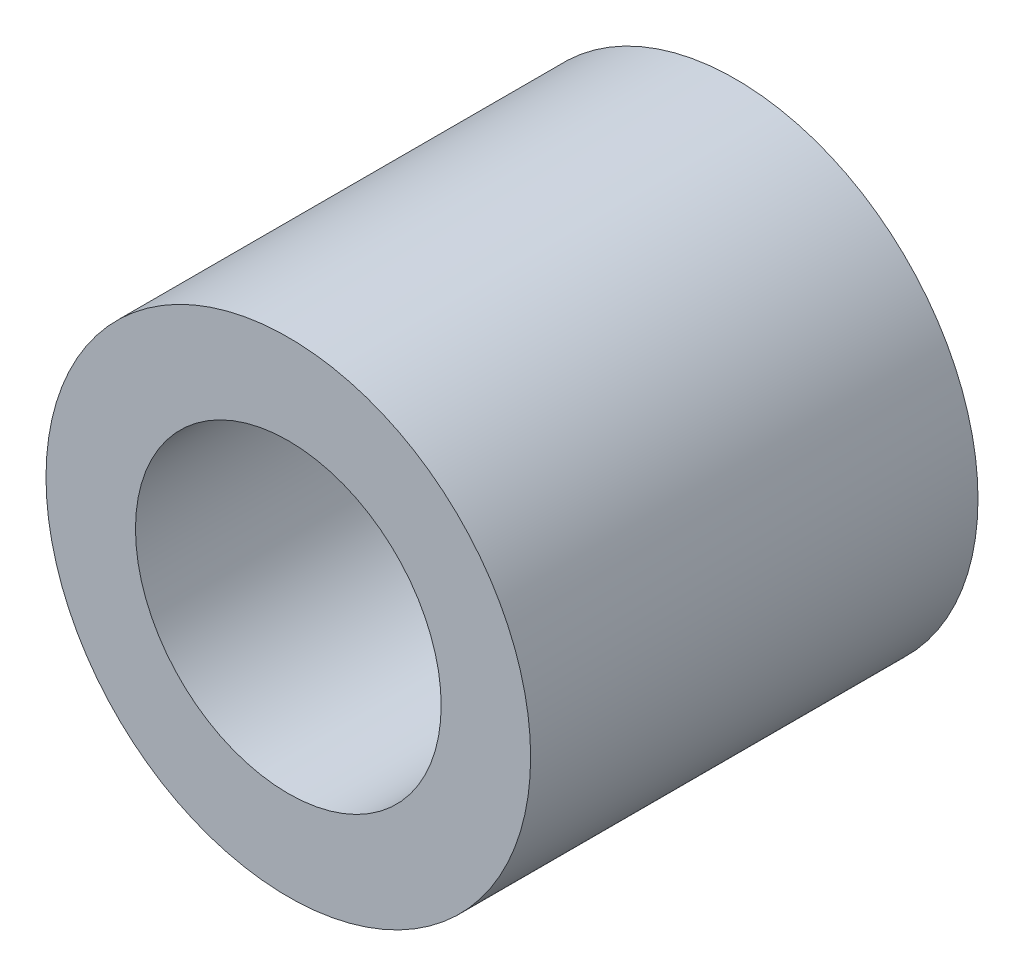
ISO-10303-21;
HEADER;
FILE_DESCRIPTION(('STEP AP214'),'2;1');
FILE_NAME('part.step','',(''),(''),'','','');
FILE_SCHEMA(('AUTOMOTIVE_DESIGN { 1 0 10303 214 1 1 1 1 }'));
ENDSEC;
DATA;
#1=APPLICATION_CONTEXT('core data for automotive mechanical design processes');
#2=APPLICATION_PROTOCOL_DEFINITION('international standard','automotive_design',2000,#1);
#3=PRODUCT_CONTEXT('',#1,'mechanical');
#4=PRODUCT('Part','Part','',(#3));
#5=PRODUCT_RELATED_PRODUCT_CATEGORY('part','',(#4));
#6=PRODUCT_DEFINITION_FORMATION('','',#4);
#7=PRODUCT_DEFINITION_CONTEXT('part definition',#1,'design');
#8=PRODUCT_DEFINITION('design','',#6,#7);
#9=PRODUCT_DEFINITION_SHAPE('','',#8);
#10=(LENGTH_UNIT() NAMED_UNIT(*) SI_UNIT(.MILLI.,.METRE.));
#11=(NAMED_UNIT(*) PLANE_ANGLE_UNIT() SI_UNIT($,.RADIAN.));
#12=(NAMED_UNIT(*) SI_UNIT($,.STERADIAN.) SOLID_ANGLE_UNIT());
#13=UNCERTAINTY_MEASURE_WITH_UNIT(LENGTH_MEASURE(1.E-05),#10,'distance_accuracy_value','');
#14=(GEOMETRIC_REPRESENTATION_CONTEXT(3) GLOBAL_UNCERTAINTY_ASSIGNED_CONTEXT((#13)) GLOBAL_UNIT_ASSIGNED_CONTEXT((#10,
#11,#12)) REPRESENTATION_CONTEXT('',''));
#15=CARTESIAN_POINT('',(0.,0.,0.));
#16=DIRECTION('',(0.,0.,1.));
#17=DIRECTION('',(1.,0.,0.));
#18=AXIS2_PLACEMENT_3D('',#15,#16,#17);
#19=CARTESIAN_POINT('',(0.,0.,3.));
#20=DIRECTION('',(0.,0.,1.));
#21=DIRECTION('',(1.,0.,0.));
#22=AXIS2_PLACEMENT_3D('',#19,#20,#21);
#23=PLANE('',#22);
#24=CARTESIAN_POINT('',(0.,0.,3.));
#25=DIRECTION('',(0.,0.,1.));
#26=DIRECTION('',(1.,0.,0.));
#27=AXIS2_PLACEMENT_3D('',#24,#25,#26);
#28=CIRCLE('',#27,1.625);
#29=CARTESIAN_POINT('',(1.625,0.,3.));
#30=VERTEX_POINT('',#29);
#31=EDGE_CURVE('E10',#30,#30,#28,.T.);
#32=ORIENTED_EDGE('',*,*,#31,.T.);
#33=EDGE_LOOP('',(#32));
#34=FACE_BOUND('',#33,.T.);
#35=CARTESIAN_POINT('',(0.,0.,3.));
#36=DIRECTION('',(0.,0.,1.));
#37=DIRECTION('',(1.,0.,0.));
#38=AXIS2_PLACEMENT_3D('',#35,#36,#37);
#39=CIRCLE('',#38,1.025);
#40=CARTESIAN_POINT('',(1.025,0.,3.));
#41=VERTEX_POINT('',#40);
#42=EDGE_CURVE('E45',#41,#41,#39,.T.);
#43=ORIENTED_EDGE('',*,*,#42,.F.);
#44=EDGE_LOOP('',(#43));
#45=FACE_BOUND('',#44,.T.);
#46=ADVANCED_FACE('F34',(#34,#45),#23,.T.);
#47=CARTESIAN_POINT('',(0.,0.,0.));
#48=DIRECTION('',(0.,0.,1.));
#49=DIRECTION('',(1.,0.,0.));
#50=AXIS2_PLACEMENT_3D('',#47,#48,#49);
#51=PLANE('',#50);
#52=CARTESIAN_POINT('',(0.,0.,0.));
#53=DIRECTION('',(0.,0.,1.));
#54=DIRECTION('',(1.,0.,0.));
#55=AXIS2_PLACEMENT_3D('',#52,#53,#54);
#56=CIRCLE('',#55,1.625);
#57=CARTESIAN_POINT('',(1.625,0.,0.));
#58=VERTEX_POINT('',#57);
#59=EDGE_CURVE('E38',#58,#58,#56,.T.);
#60=ORIENTED_EDGE('',*,*,#59,.F.);
#61=EDGE_LOOP('',(#60));
#62=FACE_BOUND('',#61,.T.);
#63=CARTESIAN_POINT('',(0.,0.,0.));
#64=DIRECTION('',(0.,0.,1.));
#65=DIRECTION('',(1.,0.,0.));
#66=AXIS2_PLACEMENT_3D('',#63,#64,#65);
#67=CIRCLE('',#66,1.025);
#68=CARTESIAN_POINT('',(1.025,0.,0.));
#69=VERTEX_POINT('',#68);
#70=EDGE_CURVE('E47',#69,#69,#67,.T.);
#71=ORIENTED_EDGE('',*,*,#70,.T.);
#72=EDGE_LOOP('',(#71));
#73=FACE_BOUND('',#72,.T.);
#74=ADVANCED_FACE('F57',(#62,#73),#51,.F.);
#75=CARTESIAN_POINT('',(0.,0.,3.));
#76=DIRECTION('',(0.,0.,-1.));
#77=DIRECTION('',(-1.,0.,0.));
#78=AXIS2_PLACEMENT_3D('',#75,#76,#77);
#79=CYLINDRICAL_SURFACE('',#78,1.625);
#80=ORIENTED_EDGE('',*,*,#31,.F.);
#81=EDGE_LOOP('',(#80));
#82=FACE_BOUND('',#81,.T.);
#83=ORIENTED_EDGE('',*,*,#59,.T.);
#84=EDGE_LOOP('',(#83));
#85=FACE_BOUND('',#84,.T.);
#86=ADVANCED_FACE('F36',(#82,#85),#79,.T.);
#87=CARTESIAN_POINT('',(0.,0.,3.));
#88=DIRECTION('',(0.,0.,-1.));
#89=DIRECTION('',(-1.,0.,0.));
#90=AXIS2_PLACEMENT_3D('',#87,#88,#89);
#91=CYLINDRICAL_SURFACE('',#90,1.025);
#92=ORIENTED_EDGE('',*,*,#42,.T.);
#93=EDGE_LOOP('',(#92));
#94=FACE_BOUND('',#93,.T.);
#95=ORIENTED_EDGE('',*,*,#70,.F.);
#96=EDGE_LOOP('',(#95));
#97=FACE_BOUND('',#96,.T.);
#98=ADVANCED_FACE('F53',(#94,#97),#91,.F.);
#99=CLOSED_SHELL('',(#46,#74,#86,#98));
#100=MANIFOLD_SOLID_BREP('B2',#99);
#101=ADVANCED_BREP_SHAPE_REPRESENTATION('',(#18,#100),#14);
#102=SHAPE_DEFINITION_REPRESENTATION(#9,#101);
ENDSEC;
END-ISO-10303-21;
